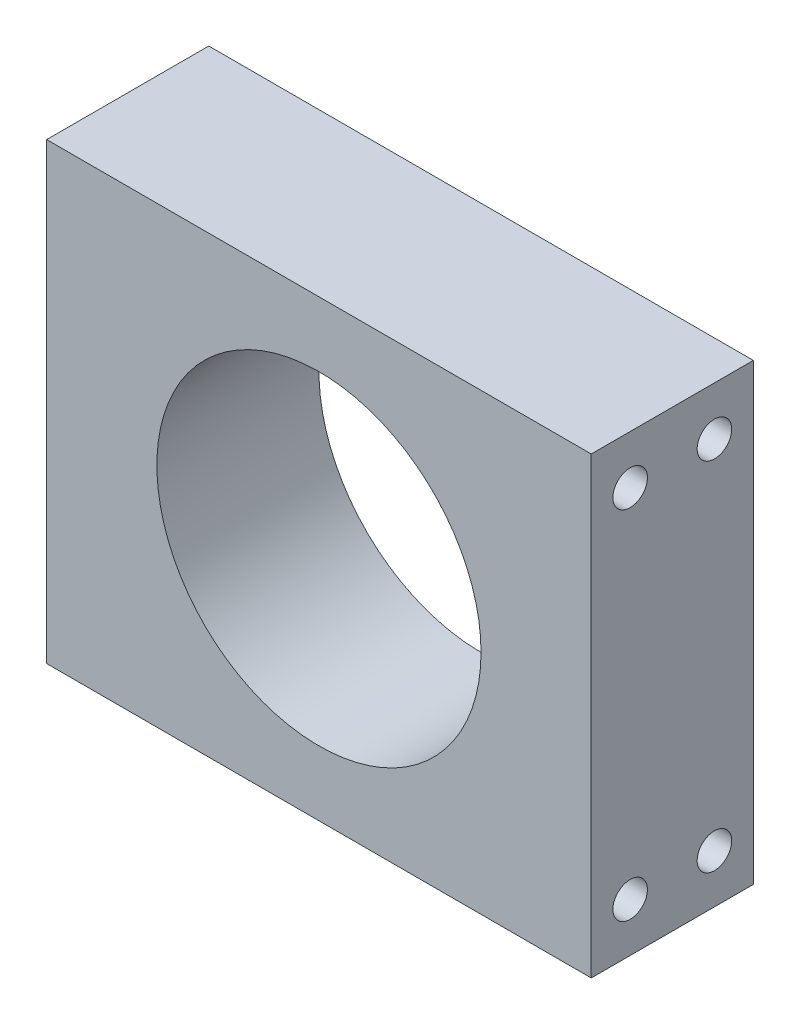
ISO-10303-21;
HEADER;
FILE_DESCRIPTION(('STEP AP214'),'2;1');
FILE_NAME('part.step','',(''),(''),'','','');
FILE_SCHEMA(('AUTOMOTIVE_DESIGN { 1 0 10303 214 1 1 1 1 }'));
ENDSEC;
DATA;
#1=APPLICATION_CONTEXT('core data for automotive mechanical design processes');
#2=APPLICATION_PROTOCOL_DEFINITION('international standard','automotive_design',2000,#1);
#3=PRODUCT_CONTEXT('',#1,'mechanical');
#4=PRODUCT('Part','Part','',(#3));
#5=PRODUCT_RELATED_PRODUCT_CATEGORY('part','',(#4));
#6=PRODUCT_DEFINITION_FORMATION('','',#4);
#7=PRODUCT_DEFINITION_CONTEXT('part definition',#1,'design');
#8=PRODUCT_DEFINITION('design','',#6,#7);
#9=PRODUCT_DEFINITION_SHAPE('','',#8);
#10=(LENGTH_UNIT() NAMED_UNIT(*) SI_UNIT(.MILLI.,.METRE.));
#11=(NAMED_UNIT(*) PLANE_ANGLE_UNIT() SI_UNIT($,.RADIAN.));
#12=(NAMED_UNIT(*) SI_UNIT($,.STERADIAN.) SOLID_ANGLE_UNIT());
#13=UNCERTAINTY_MEASURE_WITH_UNIT(LENGTH_MEASURE(1.E-05),#10,'distance_accuracy_value','');
#14=(GEOMETRIC_REPRESENTATION_CONTEXT(3) GLOBAL_UNCERTAINTY_ASSIGNED_CONTEXT((#13)) GLOBAL_UNIT_ASSIGNED_CONTEXT((#10,
#11,#12)) REPRESENTATION_CONTEXT('',''));
#15=CARTESIAN_POINT('',(0.,0.,0.));
#16=DIRECTION('',(0.,0.,1.));
#17=DIRECTION('',(1.,0.,0.));
#18=AXIS2_PLACEMENT_3D('',#15,#16,#17);
#19=CARTESIAN_POINT('',(0.,0.,12.7));
#20=DIRECTION('',(0.,0.,1.));
#21=DIRECTION('',(1.,0.,0.));
#22=AXIS2_PLACEMENT_3D('',#19,#20,#21);
#23=PLANE('',#22);
#24=DIRECTION('',(0.,-1.,0.));
#25=VECTOR('',#24,1.);
#26=CARTESIAN_POINT('',(-21.336,-17.78,12.7));
#27=LINE('',#26,#25);
#28=CARTESIAN_POINT('',(-21.336,17.78,12.7));
#29=VERTEX_POINT('',#28);
#30=CARTESIAN_POINT('',(-21.336,-17.78,12.7));
#31=VERTEX_POINT('',#30);
#32=EDGE_CURVE('E170',#29,#31,#27,.T.);
#33=ORIENTED_EDGE('',*,*,#32,.T.);
#34=DIRECTION('',(1.,0.,0.));
#35=VECTOR('',#34,1.);
#36=CARTESIAN_POINT('',(21.336,-17.78,12.7));
#37=LINE('',#36,#35);
#38=CARTESIAN_POINT('',(21.336,-17.78,12.7));
#39=VERTEX_POINT('',#38);
#40=EDGE_CURVE('E81',#31,#39,#37,.T.);
#41=ORIENTED_EDGE('',*,*,#40,.T.);
#42=DIRECTION('',(0.,1.,0.));
#43=VECTOR('',#42,1.);
#44=CARTESIAN_POINT('',(21.336,-17.78,12.7));
#45=LINE('',#44,#43);
#46=CARTESIAN_POINT('',(21.336,17.78,12.7));
#47=VERTEX_POINT('',#46);
#48=EDGE_CURVE('E173',#39,#47,#45,.T.);
#49=ORIENTED_EDGE('',*,*,#48,.T.);
#50=DIRECTION('',(-1.,0.,0.));
#51=VECTOR('',#50,1.);
#52=CARTESIAN_POINT('',(21.336,17.78,12.7));
#53=LINE('',#52,#51);
#54=EDGE_CURVE('E50',#47,#29,#53,.T.);
#55=ORIENTED_EDGE('',*,*,#54,.T.);
#56=EDGE_LOOP('',(#33,#41,#49,#55));
#57=FACE_BOUND('',#56,.T.);
#58=CARTESIAN_POINT('',(0.,0.,12.7));
#59=DIRECTION('',(0.,0.,1.));
#60=DIRECTION('',(1.,0.,0.));
#61=AXIS2_PLACEMENT_3D('',#58,#59,#60);
#62=CIRCLE('',#61,12.7);
#63=CARTESIAN_POINT('',(12.7,0.,12.7));
#64=VERTEX_POINT('',#63);
#65=EDGE_CURVE('E164',#64,#64,#62,.T.);
#66=ORIENTED_EDGE('',*,*,#65,.F.);
#67=EDGE_LOOP('',(#66));
#68=FACE_BOUND('',#67,.T.);
#69=ADVANCED_FACE('F33',(#57,#68),#23,.T.);
#70=CARTESIAN_POINT('',(0.,0.,0.));
#71=DIRECTION('',(0.,0.,1.));
#72=DIRECTION('',(1.,0.,0.));
#73=AXIS2_PLACEMENT_3D('',#70,#71,#72);
#74=PLANE('',#73);
#75=DIRECTION('',(0.,-1.,0.));
#76=VECTOR('',#75,1.);
#77=CARTESIAN_POINT('',(-21.336,-17.78,0.));
#78=LINE('',#77,#76);
#79=CARTESIAN_POINT('',(-21.336,17.78,0.));
#80=VERTEX_POINT('',#79);
#81=CARTESIAN_POINT('',(-21.336,-17.78,0.));
#82=VERTEX_POINT('',#81);
#83=EDGE_CURVE('E167',#80,#82,#78,.T.);
#84=ORIENTED_EDGE('',*,*,#83,.F.);
#85=DIRECTION('',(-1.,0.,0.));
#86=VECTOR('',#85,1.);
#87=CARTESIAN_POINT('',(21.336,17.78,0.));
#88=LINE('',#87,#86);
#89=CARTESIAN_POINT('',(21.336,17.78,0.));
#90=VERTEX_POINT('',#89);
#91=EDGE_CURVE('E74',#90,#80,#88,.T.);
#92=ORIENTED_EDGE('',*,*,#91,.F.);
#93=DIRECTION('',(0.,1.,0.));
#94=VECTOR('',#93,1.);
#95=CARTESIAN_POINT('',(21.336,-17.78,0.));
#96=LINE('',#95,#94);
#97=CARTESIAN_POINT('',(21.336,-17.78,0.));
#98=VERTEX_POINT('',#97);
#99=EDGE_CURVE('E68',#98,#90,#96,.T.);
#100=ORIENTED_EDGE('',*,*,#99,.F.);
#101=DIRECTION('',(1.,0.,0.));
#102=VECTOR('',#101,1.);
#103=CARTESIAN_POINT('',(21.336,-17.78,0.));
#104=LINE('',#103,#102);
#105=EDGE_CURVE('E179',#82,#98,#104,.T.);
#106=ORIENTED_EDGE('',*,*,#105,.F.);
#107=EDGE_LOOP('',(#84,#92,#100,#106));
#108=FACE_BOUND('',#107,.T.);
#109=CARTESIAN_POINT('',(0.,0.,0.));
#110=DIRECTION('',(0.,0.,1.));
#111=DIRECTION('',(1.,0.,0.));
#112=AXIS2_PLACEMENT_3D('',#109,#110,#111);
#113=CIRCLE('',#112,12.7);
#114=CARTESIAN_POINT('',(12.7,0.,0.));
#115=VERTEX_POINT('',#114);
#116=EDGE_CURVE('E163',#115,#115,#113,.T.);
#117=ORIENTED_EDGE('',*,*,#116,.T.);
#118=EDGE_LOOP('',(#117));
#119=FACE_BOUND('',#118,.T.);
#120=ADVANCED_FACE('F189',(#108,#119),#74,.F.);
#121=CARTESIAN_POINT('',(-21.336,-17.78,12.7));
#122=DIRECTION('',(1.,0.,0.));
#123=DIRECTION('',(0.,1.,0.));
#124=AXIS2_PLACEMENT_3D('',#121,#122,#123);
#125=PLANE('',#124);
#126=CARTESIAN_POINT('',(-21.336,13.97,3.048));
#127=DIRECTION('',(-1.,0.,0.));
#128=DIRECTION('',(0.,0.,1.));
#129=AXIS2_PLACEMENT_3D('',#126,#127,#128);
#130=CIRCLE('',#129,1.35254999999999);
#131=CARTESIAN_POINT('',(-21.336,13.97,4.40054999999999));
#132=VERTEX_POINT('',#131);
#133=EDGE_CURVE('E117',#132,#132,#130,.T.);
#134=ORIENTED_EDGE('',*,*,#133,.F.);
#135=EDGE_LOOP('',(#134));
#136=FACE_BOUND('',#135,.T.);
#137=CARTESIAN_POINT('',(-21.336,-13.97,3.048));
#138=DIRECTION('',(-1.,0.,0.));
#139=DIRECTION('',(0.,0.,1.));
#140=AXIS2_PLACEMENT_3D('',#137,#138,#139);
#141=CIRCLE('',#140,1.35254999999999);
#142=CARTESIAN_POINT('',(-21.336,-13.97,4.40054999999999));
#143=VERTEX_POINT('',#142);
#144=EDGE_CURVE('E116',#143,#143,#141,.T.);
#145=ORIENTED_EDGE('',*,*,#144,.F.);
#146=EDGE_LOOP('',(#145));
#147=FACE_BOUND('',#146,.T.);
#148=CARTESIAN_POINT('',(-21.336,13.97,9.652));
#149=DIRECTION('',(-1.,0.,0.));
#150=DIRECTION('',(0.,0.,1.));
#151=AXIS2_PLACEMENT_3D('',#148,#149,#150);
#152=CIRCLE('',#151,1.35254999999999);
#153=CARTESIAN_POINT('',(-21.336,13.97,11.00455));
#154=VERTEX_POINT('',#153);
#155=EDGE_CURVE('E127',#154,#154,#152,.T.);
#156=ORIENTED_EDGE('',*,*,#155,.F.);
#157=EDGE_LOOP('',(#156));
#158=FACE_BOUND('',#157,.T.);
#159=CARTESIAN_POINT('',(-21.336,-13.97,9.652));
#160=DIRECTION('',(-1.,0.,0.));
#161=DIRECTION('',(0.,0.,1.));
#162=AXIS2_PLACEMENT_3D('',#159,#160,#161);
#163=CIRCLE('',#162,1.35254999999999);
#164=CARTESIAN_POINT('',(-21.336,-13.97,11.00455));
#165=VERTEX_POINT('',#164);
#166=EDGE_CURVE('E133',#165,#165,#163,.T.);
#167=ORIENTED_EDGE('',*,*,#166,.F.);
#168=EDGE_LOOP('',(#167));
#169=FACE_BOUND('',#168,.T.);
#170=ORIENTED_EDGE('',*,*,#83,.T.);
#171=DIRECTION('',(0.,0.,-1.));
#172=VECTOR('',#171,1.);
#173=CARTESIAN_POINT('',(-21.336,-17.78,12.7));
#174=LINE('',#173,#172);
#175=EDGE_CURVE('E11',#31,#82,#174,.T.);
#176=ORIENTED_EDGE('',*,*,#175,.F.);
#177=ORIENTED_EDGE('',*,*,#32,.F.);
#178=DIRECTION('',(0.,0.,-1.));
#179=VECTOR('',#178,1.);
#180=CARTESIAN_POINT('',(-21.336,17.78,12.7));
#181=LINE('',#180,#179);
#182=EDGE_CURVE('E176',#29,#80,#181,.T.);
#183=ORIENTED_EDGE('',*,*,#182,.T.);
#184=EDGE_LOOP('',(#170,#176,#177,#183));
#185=FACE_BOUND('',#184,.T.);
#186=ADVANCED_FACE('F35',(#136,#147,#158,#169,#185),#125,.F.);
#187=CARTESIAN_POINT('',(21.336,-17.78,12.7));
#188=DIRECTION('',(0.,1.,0.));
#189=DIRECTION('',(-1.,0.,0.));
#190=AXIS2_PLACEMENT_3D('',#187,#188,#189);
#191=PLANE('',#190);
#192=ORIENTED_EDGE('',*,*,#105,.T.);
#193=DIRECTION('',(0.,0.,-1.));
#194=VECTOR('',#193,1.);
#195=CARTESIAN_POINT('',(21.336,-17.78,12.7));
#196=LINE('',#195,#194);
#197=EDGE_CURVE('E42',#39,#98,#196,.T.);
#198=ORIENTED_EDGE('',*,*,#197,.F.);
#199=ORIENTED_EDGE('',*,*,#40,.F.);
#200=ORIENTED_EDGE('',*,*,#175,.T.);
#201=EDGE_LOOP('',(#192,#198,#199,#200));
#202=FACE_BOUND('',#201,.T.);
#203=ADVANCED_FACE('F205',(#202),#191,.F.);
#204=CARTESIAN_POINT('',(21.336,-17.78,12.7));
#205=DIRECTION('',(-1.,0.,0.));
#206=DIRECTION('',(0.,0.,1.));
#207=AXIS2_PLACEMENT_3D('',#204,#205,#206);
#208=PLANE('',#207);
#209=CARTESIAN_POINT('',(21.336,13.97,3.048));
#210=DIRECTION('',(1.,0.,0.));
#211=DIRECTION('',(0.,0.,-1.));
#212=AXIS2_PLACEMENT_3D('',#209,#210,#211);
#213=CIRCLE('',#212,1.35254999999999);
#214=CARTESIAN_POINT('',(21.336,13.97,1.69545000000001));
#215=VERTEX_POINT('',#214);
#216=EDGE_CURVE('E139',#215,#215,#213,.T.);
#217=ORIENTED_EDGE('',*,*,#216,.F.);
#218=EDGE_LOOP('',(#217));
#219=FACE_BOUND('',#218,.T.);
#220=CARTESIAN_POINT('',(21.336,-13.97,3.048));
#221=DIRECTION('',(1.,0.,0.));
#222=DIRECTION('',(0.,0.,-1.));
#223=AXIS2_PLACEMENT_3D('',#220,#221,#222);
#224=CIRCLE('',#223,1.35254999999999);
#225=CARTESIAN_POINT('',(21.336,-13.97,1.69545000000001));
#226=VERTEX_POINT('',#225);
#227=EDGE_CURVE('E145',#226,#226,#224,.T.);
#228=ORIENTED_EDGE('',*,*,#227,.F.);
#229=EDGE_LOOP('',(#228));
#230=FACE_BOUND('',#229,.T.);
#231=CARTESIAN_POINT('',(21.336,13.97,9.652));
#232=DIRECTION('',(1.,0.,0.));
#233=DIRECTION('',(0.,0.,-1.));
#234=AXIS2_PLACEMENT_3D('',#231,#232,#233);
#235=CIRCLE('',#234,1.35254999999999);
#236=CARTESIAN_POINT('',(21.336,13.97,8.29945000000001));
#237=VERTEX_POINT('',#236);
#238=EDGE_CURVE('E151',#237,#237,#235,.T.);
#239=ORIENTED_EDGE('',*,*,#238,.F.);
#240=EDGE_LOOP('',(#239));
#241=FACE_BOUND('',#240,.T.);
#242=CARTESIAN_POINT('',(21.336,-13.97,9.652));
#243=DIRECTION('',(1.,0.,0.));
#244=DIRECTION('',(0.,0.,-1.));
#245=AXIS2_PLACEMENT_3D('',#242,#243,#244);
#246=CIRCLE('',#245,1.35254999999999);
#247=CARTESIAN_POINT('',(21.336,-13.97,8.29945000000001));
#248=VERTEX_POINT('',#247);
#249=EDGE_CURVE('E157',#248,#248,#246,.T.);
#250=ORIENTED_EDGE('',*,*,#249,.F.);
#251=EDGE_LOOP('',(#250));
#252=FACE_BOUND('',#251,.T.);
#253=ORIENTED_EDGE('',*,*,#99,.T.);
#254=DIRECTION('',(0.,0.,-1.));
#255=VECTOR('',#254,1.);
#256=CARTESIAN_POINT('',(21.336,17.78,12.7));
#257=LINE('',#256,#255);
#258=EDGE_CURVE('E184',#47,#90,#257,.T.);
#259=ORIENTED_EDGE('',*,*,#258,.F.);
#260=ORIENTED_EDGE('',*,*,#48,.F.);
#261=ORIENTED_EDGE('',*,*,#197,.T.);
#262=EDGE_LOOP('',(#253,#259,#260,#261));
#263=FACE_BOUND('',#262,.T.);
#264=ADVANCED_FACE('F186',(#219,#230,#241,#252,#263),#208,.F.);
#265=CARTESIAN_POINT('',(21.336,17.78,12.7));
#266=DIRECTION('',(0.,-1.,0.));
#267=DIRECTION('',(1.,0.,0.));
#268=AXIS2_PLACEMENT_3D('',#265,#266,#267);
#269=PLANE('',#268);
#270=ORIENTED_EDGE('',*,*,#91,.T.);
#271=ORIENTED_EDGE('',*,*,#182,.F.);
#272=ORIENTED_EDGE('',*,*,#54,.F.);
#273=ORIENTED_EDGE('',*,*,#258,.T.);
#274=EDGE_LOOP('',(#270,#271,#272,#273));
#275=FACE_BOUND('',#274,.T.);
#276=ADVANCED_FACE('F194',(#275),#269,.F.);
#277=CARTESIAN_POINT('',(0.,0.,12.7));
#278=DIRECTION('',(0.,0.,-1.));
#279=DIRECTION('',(-1.,0.,0.));
#280=AXIS2_PLACEMENT_3D('',#277,#278,#279);
#281=CYLINDRICAL_SURFACE('',#280,12.7);
#282=ORIENTED_EDGE('',*,*,#65,.T.);
#283=EDGE_LOOP('',(#282));
#284=FACE_BOUND('',#283,.T.);
#285=ORIENTED_EDGE('',*,*,#116,.F.);
#286=EDGE_LOOP('',(#285));
#287=FACE_BOUND('',#286,.T.);
#288=ADVANCED_FACE('F196',(#284,#287),#281,.F.);
#289=CARTESIAN_POINT('',(14.986,-13.97,9.652));
#290=DIRECTION('',(1.,0.,0.));
#291=DIRECTION('',(0.,0.,-1.));
#292=AXIS2_PLACEMENT_3D('',#289,#290,#291);
#293=CONICAL_SURFACE('',#292,1.35255,1.02974425867665);
#294=CARTESIAN_POINT('',(14.1733059697343,-13.97,9.652));
#295=VERTEX_POINT('',#294);
#296=VERTEX_LOOP('',#295);
#297=FACE_BOUND('',#296,.T.);
#298=CARTESIAN_POINT('',(14.986,-13.97,9.652));
#299=DIRECTION('',(1.,0.,0.));
#300=DIRECTION('',(0.,0.,-1.));
#301=AXIS2_PLACEMENT_3D('',#298,#299,#300);
#302=CIRCLE('',#301,1.35255);
#303=CARTESIAN_POINT('',(14.986,-13.97,8.29945));
#304=VERTEX_POINT('',#303);
#305=EDGE_CURVE('E160',#304,#304,#302,.T.);
#306=ORIENTED_EDGE('',*,*,#305,.T.);
#307=EDGE_LOOP('',(#306));
#308=FACE_BOUND('',#307,.T.);
#309=ADVANCED_FACE('F202',(#297,#308),#293,.F.);
#310=CARTESIAN_POINT('',(21.336,-13.97,9.652));
#311=DIRECTION('',(1.,0.,0.));
#312=DIRECTION('',(0.,0.,-1.));
#313=AXIS2_PLACEMENT_3D('',#310,#311,#312);
#314=CYLINDRICAL_SURFACE('',#313,1.35254999999999);
#315=ORIENTED_EDGE('',*,*,#305,.F.);
#316=EDGE_LOOP('',(#315));
#317=FACE_BOUND('',#316,.T.);
#318=ORIENTED_EDGE('',*,*,#249,.T.);
#319=EDGE_LOOP('',(#318));
#320=FACE_BOUND('',#319,.T.);
#321=ADVANCED_FACE('F218',(#317,#320),#314,.F.);
#322=CARTESIAN_POINT('',(14.986,13.97,9.652));
#323=DIRECTION('',(1.,0.,0.));
#324=DIRECTION('',(0.,0.,-1.));
#325=AXIS2_PLACEMENT_3D('',#322,#323,#324);
#326=CONICAL_SURFACE('',#325,1.35255,1.02974425867665);
#327=CARTESIAN_POINT('',(14.1733059697343,13.97,9.652));
#328=VERTEX_POINT('',#327);
#329=VERTEX_LOOP('',#328);
#330=FACE_BOUND('',#329,.T.);
#331=CARTESIAN_POINT('',(14.986,13.97,9.652));
#332=DIRECTION('',(1.,0.,0.));
#333=DIRECTION('',(0.,0.,-1.));
#334=AXIS2_PLACEMENT_3D('',#331,#332,#333);
#335=CIRCLE('',#334,1.35255);
#336=CARTESIAN_POINT('',(14.986,13.97,8.29945));
#337=VERTEX_POINT('',#336);
#338=EDGE_CURVE('E154',#337,#337,#335,.T.);
#339=ORIENTED_EDGE('',*,*,#338,.T.);
#340=EDGE_LOOP('',(#339));
#341=FACE_BOUND('',#340,.T.);
#342=ADVANCED_FACE('F222',(#330,#341),#326,.F.);
#343=CARTESIAN_POINT('',(21.336,13.97,9.652));
#344=DIRECTION('',(1.,0.,0.));
#345=DIRECTION('',(0.,0.,-1.));
#346=AXIS2_PLACEMENT_3D('',#343,#344,#345);
#347=CYLINDRICAL_SURFACE('',#346,1.35254999999999);
#348=ORIENTED_EDGE('',*,*,#338,.F.);
#349=EDGE_LOOP('',(#348));
#350=FACE_BOUND('',#349,.T.);
#351=ORIENTED_EDGE('',*,*,#238,.T.);
#352=EDGE_LOOP('',(#351));
#353=FACE_BOUND('',#352,.T.);
#354=ADVANCED_FACE('F226',(#350,#353),#347,.F.);
#355=CARTESIAN_POINT('',(14.986,-13.97,3.048));
#356=DIRECTION('',(1.,0.,0.));
#357=DIRECTION('',(0.,0.,-1.));
#358=AXIS2_PLACEMENT_3D('',#355,#356,#357);
#359=CONICAL_SURFACE('',#358,1.35255,1.02974425867665);
#360=CARTESIAN_POINT('',(14.1733059697343,-13.97,3.048));
#361=VERTEX_POINT('',#360);
#362=VERTEX_LOOP('',#361);
#363=FACE_BOUND('',#362,.T.);
#364=CARTESIAN_POINT('',(14.986,-13.97,3.048));
#365=DIRECTION('',(1.,0.,0.));
#366=DIRECTION('',(0.,0.,-1.));
#367=AXIS2_PLACEMENT_3D('',#364,#365,#366);
#368=CIRCLE('',#367,1.35255);
#369=CARTESIAN_POINT('',(14.986,-13.97,1.69545));
#370=VERTEX_POINT('',#369);
#371=EDGE_CURVE('E148',#370,#370,#368,.T.);
#372=ORIENTED_EDGE('',*,*,#371,.T.);
#373=EDGE_LOOP('',(#372));
#374=FACE_BOUND('',#373,.T.);
#375=ADVANCED_FACE('F230',(#363,#374),#359,.F.);
#376=CARTESIAN_POINT('',(21.336,-13.97,3.048));
#377=DIRECTION('',(1.,0.,0.));
#378=DIRECTION('',(0.,0.,-1.));
#379=AXIS2_PLACEMENT_3D('',#376,#377,#378);
#380=CYLINDRICAL_SURFACE('',#379,1.35254999999999);
#381=ORIENTED_EDGE('',*,*,#371,.F.);
#382=EDGE_LOOP('',(#381));
#383=FACE_BOUND('',#382,.T.);
#384=ORIENTED_EDGE('',*,*,#227,.T.);
#385=EDGE_LOOP('',(#384));
#386=FACE_BOUND('',#385,.T.);
#387=ADVANCED_FACE('F234',(#383,#386),#380,.F.);
#388=CARTESIAN_POINT('',(14.986,13.97,3.048));
#389=DIRECTION('',(1.,0.,0.));
#390=DIRECTION('',(0.,0.,-1.));
#391=AXIS2_PLACEMENT_3D('',#388,#389,#390);
#392=CONICAL_SURFACE('',#391,1.35255,1.02974425867665);
#393=CARTESIAN_POINT('',(14.1733059697343,13.97,3.048));
#394=VERTEX_POINT('',#393);
#395=VERTEX_LOOP('',#394);
#396=FACE_BOUND('',#395,.T.);
#397=CARTESIAN_POINT('',(14.986,13.97,3.048));
#398=DIRECTION('',(1.,0.,0.));
#399=DIRECTION('',(0.,0.,-1.));
#400=AXIS2_PLACEMENT_3D('',#397,#398,#399);
#401=CIRCLE('',#400,1.35255);
#402=CARTESIAN_POINT('',(14.986,13.97,1.69545));
#403=VERTEX_POINT('',#402);
#404=EDGE_CURVE('E142',#403,#403,#401,.T.);
#405=ORIENTED_EDGE('',*,*,#404,.T.);
#406=EDGE_LOOP('',(#405));
#407=FACE_BOUND('',#406,.T.);
#408=ADVANCED_FACE('F238',(#396,#407),#392,.F.);
#409=CARTESIAN_POINT('',(21.336,13.97,3.048));
#410=DIRECTION('',(1.,0.,0.));
#411=DIRECTION('',(0.,0.,-1.));
#412=AXIS2_PLACEMENT_3D('',#409,#410,#411);
#413=CYLINDRICAL_SURFACE('',#412,1.35254999999999);
#414=ORIENTED_EDGE('',*,*,#404,.F.);
#415=EDGE_LOOP('',(#414));
#416=FACE_BOUND('',#415,.T.);
#417=ORIENTED_EDGE('',*,*,#216,.T.);
#418=EDGE_LOOP('',(#417));
#419=FACE_BOUND('',#418,.T.);
#420=ADVANCED_FACE('F242',(#416,#419),#413,.F.);
#421=CARTESIAN_POINT('',(-14.986,-13.97,9.652));
#422=DIRECTION('',(-1.,0.,0.));
#423=DIRECTION('',(0.,0.,1.));
#424=AXIS2_PLACEMENT_3D('',#421,#422,#423);
#425=CONICAL_SURFACE('',#424,1.35255,1.02974425867665);
#426=CARTESIAN_POINT('',(-14.1733059697343,-13.97,9.652));
#427=VERTEX_POINT('',#426);
#428=VERTEX_LOOP('',#427);
#429=FACE_BOUND('',#428,.T.);
#430=CARTESIAN_POINT('',(-14.986,-13.97,9.652));
#431=DIRECTION('',(-1.,0.,0.));
#432=DIRECTION('',(0.,0.,1.));
#433=AXIS2_PLACEMENT_3D('',#430,#431,#432);
#434=CIRCLE('',#433,1.35255);
#435=CARTESIAN_POINT('',(-14.986,-13.97,11.00455));
#436=VERTEX_POINT('',#435);
#437=EDGE_CURVE('E136',#436,#436,#434,.T.);
#438=ORIENTED_EDGE('',*,*,#437,.T.);
#439=EDGE_LOOP('',(#438));
#440=FACE_BOUND('',#439,.T.);
#441=ADVANCED_FACE('F246',(#429,#440),#425,.F.);
#442=CARTESIAN_POINT('',(-21.336,-13.97,9.652));
#443=DIRECTION('',(-1.,0.,0.));
#444=DIRECTION('',(0.,0.,1.));
#445=AXIS2_PLACEMENT_3D('',#442,#443,#444);
#446=CYLINDRICAL_SURFACE('',#445,1.35254999999999);
#447=ORIENTED_EDGE('',*,*,#437,.F.);
#448=EDGE_LOOP('',(#447));
#449=FACE_BOUND('',#448,.T.);
#450=ORIENTED_EDGE('',*,*,#166,.T.);
#451=EDGE_LOOP('',(#450));
#452=FACE_BOUND('',#451,.T.);
#453=ADVANCED_FACE('F250',(#449,#452),#446,.F.);
#454=CARTESIAN_POINT('',(-14.986,13.97,9.652));
#455=DIRECTION('',(-1.,0.,0.));
#456=DIRECTION('',(0.,0.,1.));
#457=AXIS2_PLACEMENT_3D('',#454,#455,#456);
#458=CONICAL_SURFACE('',#457,1.35255,1.02974425867665);
#459=CARTESIAN_POINT('',(-14.1733059697343,13.97,9.652));
#460=VERTEX_POINT('',#459);
#461=VERTEX_LOOP('',#460);
#462=FACE_BOUND('',#461,.T.);
#463=CARTESIAN_POINT('',(-14.986,13.97,9.652));
#464=DIRECTION('',(-1.,0.,0.));
#465=DIRECTION('',(0.,0.,1.));
#466=AXIS2_PLACEMENT_3D('',#463,#464,#465);
#467=CIRCLE('',#466,1.35255);
#468=CARTESIAN_POINT('',(-14.986,13.97,11.00455));
#469=VERTEX_POINT('',#468);
#470=EDGE_CURVE('E130',#469,#469,#467,.T.);
#471=ORIENTED_EDGE('',*,*,#470,.T.);
#472=EDGE_LOOP('',(#471));
#473=FACE_BOUND('',#472,.T.);
#474=ADVANCED_FACE('F254',(#462,#473),#458,.F.);
#475=CARTESIAN_POINT('',(-21.336,13.97,9.652));
#476=DIRECTION('',(-1.,0.,0.));
#477=DIRECTION('',(0.,0.,1.));
#478=AXIS2_PLACEMENT_3D('',#475,#476,#477);
#479=CYLINDRICAL_SURFACE('',#478,1.35254999999999);
#480=ORIENTED_EDGE('',*,*,#470,.F.);
#481=EDGE_LOOP('',(#480));
#482=FACE_BOUND('',#481,.T.);
#483=ORIENTED_EDGE('',*,*,#155,.T.);
#484=EDGE_LOOP('',(#483));
#485=FACE_BOUND('',#484,.T.);
#486=ADVANCED_FACE('F258',(#482,#485),#479,.F.);
#487=CARTESIAN_POINT('',(-14.986,-13.97,3.048));
#488=DIRECTION('',(-1.,0.,0.));
#489=DIRECTION('',(0.,0.,1.));
#490=AXIS2_PLACEMENT_3D('',#487,#488,#489);
#491=CONICAL_SURFACE('',#490,1.35255,1.02974425867665);
#492=CARTESIAN_POINT('',(-14.1733059697343,-13.97,3.048));
#493=VERTEX_POINT('',#492);
#494=VERTEX_LOOP('',#493);
#495=FACE_BOUND('',#494,.T.);
#496=CARTESIAN_POINT('',(-14.986,-13.97,3.048));
#497=DIRECTION('',(-1.,0.,0.));
#498=DIRECTION('',(0.,0.,1.));
#499=AXIS2_PLACEMENT_3D('',#496,#497,#498);
#500=CIRCLE('',#499,1.35255);
#501=CARTESIAN_POINT('',(-14.986,-13.97,4.40055));
#502=VERTEX_POINT('',#501);
#503=EDGE_CURVE('E120',#502,#502,#500,.T.);
#504=ORIENTED_EDGE('',*,*,#503,.T.);
#505=EDGE_LOOP('',(#504));
#506=FACE_BOUND('',#505,.T.);
#507=ADVANCED_FACE('F262',(#495,#506),#491,.F.);
#508=CARTESIAN_POINT('',(-21.336,-13.97,3.048));
#509=DIRECTION('',(-1.,0.,0.));
#510=DIRECTION('',(0.,0.,1.));
#511=AXIS2_PLACEMENT_3D('',#508,#509,#510);
#512=CYLINDRICAL_SURFACE('',#511,1.35254999999999);
#513=ORIENTED_EDGE('',*,*,#503,.F.);
#514=EDGE_LOOP('',(#513));
#515=FACE_BOUND('',#514,.T.);
#516=ORIENTED_EDGE('',*,*,#144,.T.);
#517=EDGE_LOOP('',(#516));
#518=FACE_BOUND('',#517,.T.);
#519=ADVANCED_FACE('F110',(#515,#518),#512,.F.);
#520=CARTESIAN_POINT('',(-14.986,13.97,3.048));
#521=DIRECTION('',(-1.,0.,0.));
#522=DIRECTION('',(0.,0.,1.));
#523=AXIS2_PLACEMENT_3D('',#520,#521,#522);
#524=CONICAL_SURFACE('',#523,1.35255,1.02974425867665);
#525=CARTESIAN_POINT('',(-14.1733059697343,13.97,3.048));
#526=VERTEX_POINT('',#525);
#527=VERTEX_LOOP('',#526);
#528=FACE_BOUND('',#527,.T.);
#529=CARTESIAN_POINT('',(-14.986,13.97,3.048));
#530=DIRECTION('',(-1.,0.,0.));
#531=DIRECTION('',(0.,0.,1.));
#532=AXIS2_PLACEMENT_3D('',#529,#530,#531);
#533=CIRCLE('',#532,1.35255);
#534=CARTESIAN_POINT('',(-14.986,13.97,4.40055));
#535=VERTEX_POINT('',#534);
#536=EDGE_CURVE('E114',#535,#535,#533,.T.);
#537=ORIENTED_EDGE('',*,*,#536,.T.);
#538=EDGE_LOOP('',(#537));
#539=FACE_BOUND('',#538,.T.);
#540=ADVANCED_FACE('F106',(#528,#539),#524,.F.);
#541=CARTESIAN_POINT('',(-21.336,13.97,3.048));
#542=DIRECTION('',(-1.,0.,0.));
#543=DIRECTION('',(0.,0.,1.));
#544=AXIS2_PLACEMENT_3D('',#541,#542,#543);
#545=CYLINDRICAL_SURFACE('',#544,1.35254999999999);
#546=ORIENTED_EDGE('',*,*,#536,.F.);
#547=EDGE_LOOP('',(#546));
#548=FACE_BOUND('',#547,.T.);
#549=ORIENTED_EDGE('',*,*,#133,.T.);
#550=EDGE_LOOP('',(#549));
#551=FACE_BOUND('',#550,.T.);
#552=ADVANCED_FACE('F109',(#548,#551),#545,.F.);
#553=CLOSED_SHELL('',(#69,#120,#186,#203,#264,#276,#288,#309,#321,#342,#354,#375,#387,#408,#420,
#441,#453,#474,#486,#507,#519,#540,#552));
#554=MANIFOLD_SOLID_BREP('B2',#553);
#555=ADVANCED_BREP_SHAPE_REPRESENTATION('',(#18,#554),#14);
#556=SHAPE_DEFINITION_REPRESENTATION(#9,#555);
ENDSEC;
END-ISO-10303-21;
